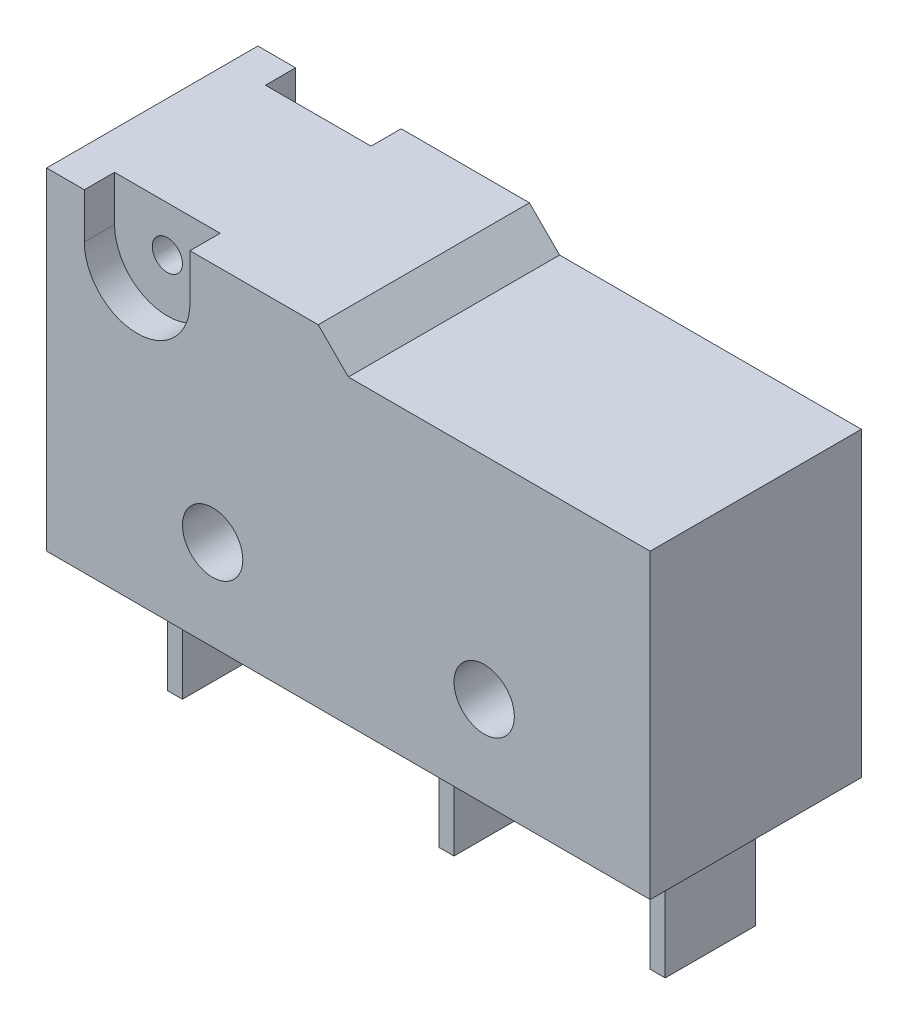
ISO-10303-21;
HEADER;
FILE_DESCRIPTION(('STEP AP214'),'2;1');
FILE_NAME('part.step','',(''),(''),'','','');
FILE_SCHEMA(('AUTOMOTIVE_DESIGN { 1 0 10303 214 1 1 1 1 }'));
ENDSEC;
DATA;
#1=APPLICATION_CONTEXT('core data for automotive mechanical design processes');
#2=APPLICATION_PROTOCOL_DEFINITION('international standard','automotive_design',2000,#1);
#3=PRODUCT_CONTEXT('',#1,'mechanical');
#4=PRODUCT('Part','Part','',(#3));
#5=PRODUCT_RELATED_PRODUCT_CATEGORY('part','',(#4));
#6=PRODUCT_DEFINITION_FORMATION('','',#4);
#7=PRODUCT_DEFINITION_CONTEXT('part definition',#1,'design');
#8=PRODUCT_DEFINITION('design','',#6,#7);
#9=PRODUCT_DEFINITION_SHAPE('','',#8);
#10=(LENGTH_UNIT() NAMED_UNIT(*) SI_UNIT(.MILLI.,.METRE.));
#11=(NAMED_UNIT(*) PLANE_ANGLE_UNIT() SI_UNIT($,.RADIAN.));
#12=(NAMED_UNIT(*) SI_UNIT($,.STERADIAN.) SOLID_ANGLE_UNIT());
#13=UNCERTAINTY_MEASURE_WITH_UNIT(LENGTH_MEASURE(1.E-05),#10,'distance_accuracy_value','');
#14=(GEOMETRIC_REPRESENTATION_CONTEXT(3) GLOBAL_UNCERTAINTY_ASSIGNED_CONTEXT((#13)) GLOBAL_UNIT_ASSIGNED_CONTEXT((#10,
#11,#12)) REPRESENTATION_CONTEXT('',''));
#15=CARTESIAN_POINT('',(0.,0.,0.));
#16=DIRECTION('',(0.,0.,1.));
#17=DIRECTION('',(1.,0.,0.));
#18=AXIS2_PLACEMENT_3D('',#15,#16,#17);
#19=CARTESIAN_POINT('',(18.,-4.,-1.5));
#20=DIRECTION('',(1.,0.,0.));
#21=DIRECTION('',(0.,0.,-1.));
#22=AXIS2_PLACEMENT_3D('',#19,#20,#21);
#23=PLANE('',#22);
#24=DIRECTION('',(0.,0.,-1.));
#25=VECTOR('',#24,1.);
#26=CARTESIAN_POINT('',(18.,0.,-1.5));
#27=LINE('',#26,#25);
#28=CARTESIAN_POINT('',(18.,0.,1.5));
#29=VERTEX_POINT('',#28);
#30=CARTESIAN_POINT('',(18.,0.,-1.5));
#31=VERTEX_POINT('',#30);
#32=EDGE_CURVE('E109',#29,#31,#27,.T.);
#33=ORIENTED_EDGE('',*,*,#32,.T.);
#34=DIRECTION('',(0.,1.,0.));
#35=VECTOR('',#34,1.);
#36=CARTESIAN_POINT('',(18.,-4.,-1.5));
#37=LINE('',#36,#35);
#38=CARTESIAN_POINT('',(18.,-4.,-1.5));
#39=VERTEX_POINT('',#38);
#40=EDGE_CURVE('E12',#39,#31,#37,.T.);
#41=ORIENTED_EDGE('',*,*,#40,.F.);
#42=DIRECTION('',(0.,0.,-1.));
#43=VECTOR('',#42,1.);
#44=CARTESIAN_POINT('',(18.,-4.,-1.5));
#45=LINE('',#44,#43);
#46=CARTESIAN_POINT('',(18.,-4.,1.5));
#47=VERTEX_POINT('',#46);
#48=EDGE_CURVE('E97',#47,#39,#45,.T.);
#49=ORIENTED_EDGE('',*,*,#48,.F.);
#50=DIRECTION('',(0.,1.,0.));
#51=VECTOR('',#50,1.);
#52=CARTESIAN_POINT('',(18.,-4.,1.5));
#53=LINE('',#52,#51);
#54=EDGE_CURVE('E105',#47,#29,#53,.T.);
#55=ORIENTED_EDGE('',*,*,#54,.T.);
#56=EDGE_LOOP('',(#33,#41,#49,#55));
#57=FACE_BOUND('',#56,.T.);
#58=ADVANCED_FACE('F46',(#57),#23,.F.);
#59=CARTESIAN_POINT('',(18.,-4.,-1.5));
#60=DIRECTION('',(0.,0.,1.));
#61=DIRECTION('',(1.,0.,0.));
#62=AXIS2_PLACEMENT_3D('',#59,#60,#61);
#63=PLANE('',#62);
#64=DIRECTION('',(1.,0.,0.));
#65=VECTOR('',#64,1.);
#66=CARTESIAN_POINT('',(18.,0.,-1.5));
#67=LINE('',#66,#65);
#68=CARTESIAN_POINT('',(18.5,0.,-1.5));
#69=VERTEX_POINT('',#68);
#70=EDGE_CURVE('E101',#31,#69,#67,.T.);
#71=ORIENTED_EDGE('',*,*,#70,.T.);
#72=DIRECTION('',(0.,1.,0.));
#73=VECTOR('',#72,1.);
#74=CARTESIAN_POINT('',(18.5,-4.,-1.5));
#75=LINE('',#74,#73);
#76=CARTESIAN_POINT('',(18.5,-4.,-1.5));
#77=VERTEX_POINT('',#76);
#78=EDGE_CURVE('E54',#77,#69,#75,.T.);
#79=ORIENTED_EDGE('',*,*,#78,.F.);
#80=DIRECTION('',(1.,0.,0.));
#81=VECTOR('',#80,1.);
#82=CARTESIAN_POINT('',(18.,-4.,-1.5));
#83=LINE('',#82,#81);
#84=EDGE_CURVE('E92',#39,#77,#83,.T.);
#85=ORIENTED_EDGE('',*,*,#84,.F.);
#86=ORIENTED_EDGE('',*,*,#40,.T.);
#87=EDGE_LOOP('',(#71,#79,#85,#86));
#88=FACE_BOUND('',#87,.T.);
#89=ADVANCED_FACE('F100',(#88),#63,.F.);
#90=CARTESIAN_POINT('',(18.5,-4.,-1.5));
#91=DIRECTION('',(-1.,0.,0.));
#92=DIRECTION('',(0.,0.,1.));
#93=AXIS2_PLACEMENT_3D('',#90,#91,#92);
#94=PLANE('',#93);
#95=DIRECTION('',(0.,0.,1.));
#96=VECTOR('',#95,1.);
#97=CARTESIAN_POINT('',(18.5,0.,-1.5));
#98=LINE('',#97,#96);
#99=CARTESIAN_POINT('',(18.5,0.,1.5));
#100=VERTEX_POINT('',#99);
#101=EDGE_CURVE('E79',#69,#100,#98,.T.);
#102=ORIENTED_EDGE('',*,*,#101,.T.);
#103=DIRECTION('',(0.,1.,0.));
#104=VECTOR('',#103,1.);
#105=CARTESIAN_POINT('',(18.5,-4.,1.5));
#106=LINE('',#105,#104);
#107=CARTESIAN_POINT('',(18.5,-4.,1.5));
#108=VERTEX_POINT('',#107);
#109=EDGE_CURVE('E102',#108,#100,#106,.T.);
#110=ORIENTED_EDGE('',*,*,#109,.F.);
#111=DIRECTION('',(0.,0.,1.));
#112=VECTOR('',#111,1.);
#113=CARTESIAN_POINT('',(18.5,-4.,-1.5));
#114=LINE('',#113,#112);
#115=EDGE_CURVE('E95',#77,#108,#114,.T.);
#116=ORIENTED_EDGE('',*,*,#115,.F.);
#117=ORIENTED_EDGE('',*,*,#78,.T.);
#118=EDGE_LOOP('',(#102,#110,#116,#117));
#119=FACE_BOUND('',#118,.T.);
#120=ADVANCED_FACE('F103',(#119),#94,.F.);
#121=CARTESIAN_POINT('',(18.,-4.,1.5));
#122=DIRECTION('',(0.,0.,-1.));
#123=DIRECTION('',(-1.,0.,0.));
#124=AXIS2_PLACEMENT_3D('',#121,#122,#123);
#125=PLANE('',#124);
#126=DIRECTION('',(-1.,0.,0.));
#127=VECTOR('',#126,1.);
#128=CARTESIAN_POINT('',(18.,0.,1.5));
#129=LINE('',#128,#127);
#130=EDGE_CURVE('E85',#100,#29,#129,.T.);
#131=ORIENTED_EDGE('',*,*,#130,.T.);
#132=ORIENTED_EDGE('',*,*,#54,.F.);
#133=DIRECTION('',(-1.,0.,0.));
#134=VECTOR('',#133,1.);
#135=CARTESIAN_POINT('',(18.,-4.,1.5));
#136=LINE('',#135,#134);
#137=EDGE_CURVE('E62',#108,#47,#136,.T.);
#138=ORIENTED_EDGE('',*,*,#137,.F.);
#139=ORIENTED_EDGE('',*,*,#109,.T.);
#140=EDGE_LOOP('',(#131,#132,#138,#139));
#141=FACE_BOUND('',#140,.T.);
#142=ADVANCED_FACE('F116',(#141),#125,.F.);
#143=CARTESIAN_POINT('',(0.,-4.,0.));
#144=DIRECTION('',(0.,1.,0.));
#145=DIRECTION('',(0.,0.,1.));
#146=AXIS2_PLACEMENT_3D('',#143,#144,#145);
#147=PLANE('',#146);
#148=ORIENTED_EDGE('',*,*,#48,.T.);
#149=ORIENTED_EDGE('',*,*,#84,.T.);
#150=ORIENTED_EDGE('',*,*,#115,.T.);
#151=ORIENTED_EDGE('',*,*,#137,.T.);
#152=EDGE_LOOP('',(#148,#149,#150,#151));
#153=FACE_BOUND('',#152,.T.);
#154=ADVANCED_FACE('F93',(#153),#147,.F.);
#155=CARTESIAN_POINT('',(0.,0.,0.));
#156=DIRECTION('',(0.,1.,0.));
#157=DIRECTION('',(0.,0.,1.));
#158=AXIS2_PLACEMENT_3D('',#155,#156,#157);
#159=PLANE('',#158);
#160=ORIENTED_EDGE('',*,*,#32,.F.);
#161=ORIENTED_EDGE('',*,*,#130,.F.);
#162=ORIENTED_EDGE('',*,*,#101,.F.);
#163=ORIENTED_EDGE('',*,*,#70,.F.);
#164=EDGE_LOOP('',(#160,#161,#162,#163));
#165=FACE_BOUND('',#164,.T.);
#166=ADVANCED_FACE('F119',(#165),#159,.T.);
#167=CLOSED_SHELL('',(#58,#89,#120,#142,#154,#166));
#168=MANIFOLD_SOLID_BREP('B2',#167);
#169=CARTESIAN_POINT('',(11.,-4.,1.5));
#170=DIRECTION('',(1.,0.,0.));
#171=DIRECTION('',(0.,0.,-1.));
#172=AXIS2_PLACEMENT_3D('',#169,#170,#171);
#173=PLANE('',#172);
#174=DIRECTION('',(0.,0.,-1.));
#175=VECTOR('',#174,1.);
#176=CARTESIAN_POINT('',(11.,0.,1.5));
#177=LINE('',#176,#175);
#178=CARTESIAN_POINT('',(11.,0.,1.5));
#179=VERTEX_POINT('',#178);
#180=CARTESIAN_POINT('',(11.,0.,-1.5));
#181=VERTEX_POINT('',#180);
#182=EDGE_CURVE('E243',#179,#181,#177,.T.);
#183=ORIENTED_EDGE('',*,*,#182,.T.);
#184=DIRECTION('',(0.,1.,0.));
#185=VECTOR('',#184,1.);
#186=CARTESIAN_POINT('',(11.,-4.,-1.5));
#187=LINE('',#186,#185);
#188=CARTESIAN_POINT('',(11.,-4.,-1.5));
#189=VERTEX_POINT('',#188);
#190=EDGE_CURVE('E44',#189,#181,#187,.T.);
#191=ORIENTED_EDGE('',*,*,#190,.F.);
#192=DIRECTION('',(0.,0.,-1.));
#193=VECTOR('',#192,1.);
#194=CARTESIAN_POINT('',(11.,-4.,1.5));
#195=LINE('',#194,#193);
#196=CARTESIAN_POINT('',(11.,-4.,1.5));
#197=VERTEX_POINT('',#196);
#198=EDGE_CURVE('E231',#197,#189,#195,.T.);
#199=ORIENTED_EDGE('',*,*,#198,.F.);
#200=DIRECTION('',(0.,1.,0.));
#201=VECTOR('',#200,1.);
#202=CARTESIAN_POINT('',(11.,-4.,1.5));
#203=LINE('',#202,#201);
#204=EDGE_CURVE('E239',#197,#179,#203,.T.);
#205=ORIENTED_EDGE('',*,*,#204,.T.);
#206=EDGE_LOOP('',(#183,#191,#199,#205));
#207=FACE_BOUND('',#206,.T.);
#208=ADVANCED_FACE('F180',(#207),#173,.F.);
#209=CARTESIAN_POINT('',(11.,-4.,-1.5));
#210=DIRECTION('',(0.,0.,1.));
#211=DIRECTION('',(1.,0.,0.));
#212=AXIS2_PLACEMENT_3D('',#209,#210,#211);
#213=PLANE('',#212);
#214=DIRECTION('',(1.,0.,0.));
#215=VECTOR('',#214,1.);
#216=CARTESIAN_POINT('',(11.,0.,-1.5));
#217=LINE('',#216,#215);
#218=CARTESIAN_POINT('',(11.5,0.,-1.5));
#219=VERTEX_POINT('',#218);
#220=EDGE_CURVE('E235',#181,#219,#217,.T.);
#221=ORIENTED_EDGE('',*,*,#220,.T.);
#222=DIRECTION('',(0.,1.,0.));
#223=VECTOR('',#222,1.);
#224=CARTESIAN_POINT('',(11.5,-4.,-1.5));
#225=LINE('',#224,#223);
#226=CARTESIAN_POINT('',(11.5,-4.,-1.5));
#227=VERTEX_POINT('',#226);
#228=EDGE_CURVE('E188',#227,#219,#225,.T.);
#229=ORIENTED_EDGE('',*,*,#228,.F.);
#230=DIRECTION('',(1.,0.,0.));
#231=VECTOR('',#230,1.);
#232=CARTESIAN_POINT('',(11.,-4.,-1.5));
#233=LINE('',#232,#231);
#234=EDGE_CURVE('E226',#189,#227,#233,.T.);
#235=ORIENTED_EDGE('',*,*,#234,.F.);
#236=ORIENTED_EDGE('',*,*,#190,.T.);
#237=EDGE_LOOP('',(#221,#229,#235,#236));
#238=FACE_BOUND('',#237,.T.);
#239=ADVANCED_FACE('F234',(#238),#213,.F.);
#240=CARTESIAN_POINT('',(11.5,-4.,1.5));
#241=DIRECTION('',(-1.,0.,0.));
#242=DIRECTION('',(0.,0.,1.));
#243=AXIS2_PLACEMENT_3D('',#240,#241,#242);
#244=PLANE('',#243);
#245=DIRECTION('',(0.,0.,1.));
#246=VECTOR('',#245,1.);
#247=CARTESIAN_POINT('',(11.5,0.,1.5));
#248=LINE('',#247,#246);
#249=CARTESIAN_POINT('',(11.5,0.,1.5));
#250=VERTEX_POINT('',#249);
#251=EDGE_CURVE('E213',#219,#250,#248,.T.);
#252=ORIENTED_EDGE('',*,*,#251,.T.);
#253=DIRECTION('',(0.,1.,0.));
#254=VECTOR('',#253,1.);
#255=CARTESIAN_POINT('',(11.5,-4.,1.5));
#256=LINE('',#255,#254);
#257=CARTESIAN_POINT('',(11.5,-4.,1.5));
#258=VERTEX_POINT('',#257);
#259=EDGE_CURVE('E236',#258,#250,#256,.T.);
#260=ORIENTED_EDGE('',*,*,#259,.F.);
#261=DIRECTION('',(0.,0.,1.));
#262=VECTOR('',#261,1.);
#263=CARTESIAN_POINT('',(11.5,-4.,1.5));
#264=LINE('',#263,#262);
#265=EDGE_CURVE('E229',#227,#258,#264,.T.);
#266=ORIENTED_EDGE('',*,*,#265,.F.);
#267=ORIENTED_EDGE('',*,*,#228,.T.);
#268=EDGE_LOOP('',(#252,#260,#266,#267));
#269=FACE_BOUND('',#268,.T.);
#270=ADVANCED_FACE('F237',(#269),#244,.F.);
#271=CARTESIAN_POINT('',(11.,-4.,1.5));
#272=DIRECTION('',(0.,0.,-1.));
#273=DIRECTION('',(-1.,0.,0.));
#274=AXIS2_PLACEMENT_3D('',#271,#272,#273);
#275=PLANE('',#274);
#276=DIRECTION('',(-1.,0.,0.));
#277=VECTOR('',#276,1.);
#278=CARTESIAN_POINT('',(11.,0.,1.5));
#279=LINE('',#278,#277);
#280=EDGE_CURVE('E219',#250,#179,#279,.T.);
#281=ORIENTED_EDGE('',*,*,#280,.T.);
#282=ORIENTED_EDGE('',*,*,#204,.F.);
#283=DIRECTION('',(-1.,0.,0.));
#284=VECTOR('',#283,1.);
#285=CARTESIAN_POINT('',(11.,-4.,1.5));
#286=LINE('',#285,#284);
#287=EDGE_CURVE('E196',#258,#197,#286,.T.);
#288=ORIENTED_EDGE('',*,*,#287,.F.);
#289=ORIENTED_EDGE('',*,*,#259,.T.);
#290=EDGE_LOOP('',(#281,#282,#288,#289));
#291=FACE_BOUND('',#290,.T.);
#292=ADVANCED_FACE('F250',(#291),#275,.F.);
#293=CARTESIAN_POINT('',(0.,-4.,0.));
#294=DIRECTION('',(0.,-1.,0.));
#295=DIRECTION('',(0.,0.,-1.));
#296=AXIS2_PLACEMENT_3D('',#293,#294,#295);
#297=PLANE('',#296);
#298=ORIENTED_EDGE('',*,*,#198,.T.);
#299=ORIENTED_EDGE('',*,*,#234,.T.);
#300=ORIENTED_EDGE('',*,*,#265,.T.);
#301=ORIENTED_EDGE('',*,*,#287,.T.);
#302=EDGE_LOOP('',(#298,#299,#300,#301));
#303=FACE_BOUND('',#302,.T.);
#304=ADVANCED_FACE('F227',(#303),#297,.T.);
#305=CARTESIAN_POINT('',(0.,0.,0.));
#306=DIRECTION('',(0.,-1.,0.));
#307=DIRECTION('',(0.,0.,-1.));
#308=AXIS2_PLACEMENT_3D('',#305,#306,#307);
#309=PLANE('',#308);
#310=ORIENTED_EDGE('',*,*,#182,.F.);
#311=ORIENTED_EDGE('',*,*,#280,.F.);
#312=ORIENTED_EDGE('',*,*,#251,.F.);
#313=ORIENTED_EDGE('',*,*,#220,.F.);
#314=EDGE_LOOP('',(#310,#311,#312,#313));
#315=FACE_BOUND('',#314,.T.);
#316=ADVANCED_FACE('F253',(#315),#309,.F.);
#317=CLOSED_SHELL('',(#208,#239,#270,#292,#304,#316));
#318=MANIFOLD_SOLID_BREP('B6',#317);
#319=CARTESIAN_POINT('',(2.,-4.,1.5));
#320=DIRECTION('',(1.,0.,0.));
#321=DIRECTION('',(0.,0.,-1.));
#322=AXIS2_PLACEMENT_3D('',#319,#320,#321);
#323=PLANE('',#322);
#324=DIRECTION('',(0.,0.,-1.));
#325=VECTOR('',#324,1.);
#326=CARTESIAN_POINT('',(2.,0.,1.5));
#327=LINE('',#326,#325);
#328=CARTESIAN_POINT('',(2.,0.,1.5));
#329=VERTEX_POINT('',#328);
#330=CARTESIAN_POINT('',(2.,0.,-1.5));
#331=VERTEX_POINT('',#330);
#332=EDGE_CURVE('E376',#329,#331,#327,.T.);
#333=ORIENTED_EDGE('',*,*,#332,.T.);
#334=DIRECTION('',(0.,1.,0.));
#335=VECTOR('',#334,1.);
#336=CARTESIAN_POINT('',(2.,-4.,-1.5));
#337=LINE('',#336,#335);
#338=CARTESIAN_POINT('',(2.,-4.,-1.5));
#339=VERTEX_POINT('',#338);
#340=EDGE_CURVE('E178',#339,#331,#337,.T.);
#341=ORIENTED_EDGE('',*,*,#340,.F.);
#342=DIRECTION('',(0.,0.,-1.));
#343=VECTOR('',#342,1.);
#344=CARTESIAN_POINT('',(2.,-4.,1.5));
#345=LINE('',#344,#343);
#346=CARTESIAN_POINT('',(2.,-4.,1.5));
#347=VERTEX_POINT('',#346);
#348=EDGE_CURVE('E364',#347,#339,#345,.T.);
#349=ORIENTED_EDGE('',*,*,#348,.F.);
#350=DIRECTION('',(0.,1.,0.));
#351=VECTOR('',#350,1.);
#352=CARTESIAN_POINT('',(2.,-4.,1.5));
#353=LINE('',#352,#351);
#354=EDGE_CURVE('E372',#347,#329,#353,.T.);
#355=ORIENTED_EDGE('',*,*,#354,.T.);
#356=EDGE_LOOP('',(#333,#341,#349,#355));
#357=FACE_BOUND('',#356,.T.);
#358=ADVANCED_FACE('F313',(#357),#323,.F.);
#359=CARTESIAN_POINT('',(2.,-4.,-1.5));
#360=DIRECTION('',(0.,0.,1.));
#361=DIRECTION('',(1.,0.,0.));
#362=AXIS2_PLACEMENT_3D('',#359,#360,#361);
#363=PLANE('',#362);
#364=DIRECTION('',(1.,0.,0.));
#365=VECTOR('',#364,1.);
#366=CARTESIAN_POINT('',(2.,0.,-1.5));
#367=LINE('',#366,#365);
#368=CARTESIAN_POINT('',(2.5,0.,-1.5));
#369=VERTEX_POINT('',#368);
#370=EDGE_CURVE('E368',#331,#369,#367,.T.);
#371=ORIENTED_EDGE('',*,*,#370,.T.);
#372=DIRECTION('',(0.,1.,0.));
#373=VECTOR('',#372,1.);
#374=CARTESIAN_POINT('',(2.5,-4.,-1.5));
#375=LINE('',#374,#373);
#376=CARTESIAN_POINT('',(2.5,-4.,-1.5));
#377=VERTEX_POINT('',#376);
#378=EDGE_CURVE('E321',#377,#369,#375,.T.);
#379=ORIENTED_EDGE('',*,*,#378,.F.);
#380=DIRECTION('',(1.,0.,0.));
#381=VECTOR('',#380,1.);
#382=CARTESIAN_POINT('',(2.,-4.,-1.5));
#383=LINE('',#382,#381);
#384=EDGE_CURVE('E359',#339,#377,#383,.T.);
#385=ORIENTED_EDGE('',*,*,#384,.F.);
#386=ORIENTED_EDGE('',*,*,#340,.T.);
#387=EDGE_LOOP('',(#371,#379,#385,#386));
#388=FACE_BOUND('',#387,.T.);
#389=ADVANCED_FACE('F367',(#388),#363,.F.);
#390=CARTESIAN_POINT('',(2.5,-4.,1.5));
#391=DIRECTION('',(-1.,0.,0.));
#392=DIRECTION('',(0.,0.,1.));
#393=AXIS2_PLACEMENT_3D('',#390,#391,#392);
#394=PLANE('',#393);
#395=DIRECTION('',(0.,0.,1.));
#396=VECTOR('',#395,1.);
#397=CARTESIAN_POINT('',(2.5,0.,1.5));
#398=LINE('',#397,#396);
#399=CARTESIAN_POINT('',(2.5,0.,1.5));
#400=VERTEX_POINT('',#399);
#401=EDGE_CURVE('E346',#369,#400,#398,.T.);
#402=ORIENTED_EDGE('',*,*,#401,.T.);
#403=DIRECTION('',(0.,1.,0.));
#404=VECTOR('',#403,1.);
#405=CARTESIAN_POINT('',(2.5,-4.,1.5));
#406=LINE('',#405,#404);
#407=CARTESIAN_POINT('',(2.5,-4.,1.5));
#408=VERTEX_POINT('',#407);
#409=EDGE_CURVE('E369',#408,#400,#406,.T.);
#410=ORIENTED_EDGE('',*,*,#409,.F.);
#411=DIRECTION('',(0.,0.,1.));
#412=VECTOR('',#411,1.);
#413=CARTESIAN_POINT('',(2.5,-4.,1.5));
#414=LINE('',#413,#412);
#415=EDGE_CURVE('E362',#377,#408,#414,.T.);
#416=ORIENTED_EDGE('',*,*,#415,.F.);
#417=ORIENTED_EDGE('',*,*,#378,.T.);
#418=EDGE_LOOP('',(#402,#410,#416,#417));
#419=FACE_BOUND('',#418,.T.);
#420=ADVANCED_FACE('F370',(#419),#394,.F.);
#421=CARTESIAN_POINT('',(2.,-4.,1.5));
#422=DIRECTION('',(0.,0.,-1.));
#423=DIRECTION('',(-1.,0.,0.));
#424=AXIS2_PLACEMENT_3D('',#421,#422,#423);
#425=PLANE('',#424);
#426=DIRECTION('',(-1.,0.,0.));
#427=VECTOR('',#426,1.);
#428=CARTESIAN_POINT('',(2.,0.,1.5));
#429=LINE('',#428,#427);
#430=EDGE_CURVE('E352',#400,#329,#429,.T.);
#431=ORIENTED_EDGE('',*,*,#430,.T.);
#432=ORIENTED_EDGE('',*,*,#354,.F.);
#433=DIRECTION('',(-1.,0.,0.));
#434=VECTOR('',#433,1.);
#435=CARTESIAN_POINT('',(2.,-4.,1.5));
#436=LINE('',#435,#434);
#437=EDGE_CURVE('E329',#408,#347,#436,.T.);
#438=ORIENTED_EDGE('',*,*,#437,.F.);
#439=ORIENTED_EDGE('',*,*,#409,.T.);
#440=EDGE_LOOP('',(#431,#432,#438,#439));
#441=FACE_BOUND('',#440,.T.);
#442=ADVANCED_FACE('F383',(#441),#425,.F.);
#443=CARTESIAN_POINT('',(0.,-4.,0.));
#444=DIRECTION('',(0.,-1.,0.));
#445=DIRECTION('',(0.,0.,-1.));
#446=AXIS2_PLACEMENT_3D('',#443,#444,#445);
#447=PLANE('',#446);
#448=ORIENTED_EDGE('',*,*,#348,.T.);
#449=ORIENTED_EDGE('',*,*,#384,.T.);
#450=ORIENTED_EDGE('',*,*,#415,.T.);
#451=ORIENTED_EDGE('',*,*,#437,.T.);
#452=EDGE_LOOP('',(#448,#449,#450,#451));
#453=FACE_BOUND('',#452,.T.);
#454=ADVANCED_FACE('F360',(#453),#447,.T.);
#455=CARTESIAN_POINT('',(0.,0.,0.));
#456=DIRECTION('',(0.,-1.,0.));
#457=DIRECTION('',(0.,0.,-1.));
#458=AXIS2_PLACEMENT_3D('',#455,#456,#457);
#459=PLANE('',#458);
#460=ORIENTED_EDGE('',*,*,#332,.F.);
#461=ORIENTED_EDGE('',*,*,#430,.F.);
#462=ORIENTED_EDGE('',*,*,#401,.F.);
#463=ORIENTED_EDGE('',*,*,#370,.F.);
#464=EDGE_LOOP('',(#460,#461,#462,#463));
#465=FACE_BOUND('',#464,.T.);
#466=ADVANCED_FACE('F386',(#465),#459,.F.);
#467=CLOSED_SHELL('',(#358,#389,#420,#442,#454,#466));
#468=MANIFOLD_SOLID_BREP('B38',#467);
#469=CARTESIAN_POINT('',(3.,9.5,3.5));
#470=DIRECTION('',(0.,0.,-1.));
#471=DIRECTION('',(-1.,0.,0.));
#472=AXIS2_PLACEMENT_3D('',#469,#470,#471);
#473=CYLINDRICAL_SURFACE('',#472,0.5);
#474=CARTESIAN_POINT('',(3.,9.5,2.5));
#475=DIRECTION('',(0.,0.,1.));
#476=DIRECTION('',(1.,0.,0.));
#477=AXIS2_PLACEMENT_3D('',#474,#475,#476);
#478=CIRCLE('',#477,0.5);
#479=CARTESIAN_POINT('',(3.5,9.5,2.5));
#480=VERTEX_POINT('',#479);
#481=EDGE_CURVE('E591',#480,#480,#478,.T.);
#482=ORIENTED_EDGE('',*,*,#481,.T.);
#483=EDGE_LOOP('',(#482));
#484=FACE_BOUND('',#483,.T.);
#485=CARTESIAN_POINT('',(3.,9.5,-2.5));
#486=DIRECTION('',(0.,0.,-1.));
#487=DIRECTION('',(-1.,0.,0.));
#488=AXIS2_PLACEMENT_3D('',#485,#486,#487);
#489=CIRCLE('',#488,0.5);
#490=CARTESIAN_POINT('',(2.5,9.5,-2.5));
#491=VERTEX_POINT('',#490);
#492=EDGE_CURVE('E568',#491,#491,#489,.T.);
#493=ORIENTED_EDGE('',*,*,#492,.T.);
#494=EDGE_LOOP('',(#493));
#495=FACE_BOUND('',#494,.T.);
#496=ADVANCED_FACE('F437',(#484,#495),#473,.F.);
#497=CARTESIAN_POINT('',(0.,0.,-3.5));
#498=DIRECTION('',(0.,0.,-1.));
#499=DIRECTION('',(-1.,0.,0.));
#500=AXIS2_PLACEMENT_3D('',#497,#498,#499);
#501=PLANE('',#500);
#502=CARTESIAN_POINT('',(14.5,3.,-3.5));
#503=DIRECTION('',(0.,0.,1.));
#504=DIRECTION('',(1.,0.,0.));
#505=AXIS2_PLACEMENT_3D('',#502,#503,#504);
#506=CIRCLE('',#505,1.);
#507=CARTESIAN_POINT('',(15.5,3.,-3.5));
#508=VERTEX_POINT('',#507);
#509=EDGE_CURVE('E600',#508,#508,#506,.T.);
#510=ORIENTED_EDGE('',*,*,#509,.T.);
#511=EDGE_LOOP('',(#510));
#512=FACE_BOUND('',#511,.T.);
#513=CARTESIAN_POINT('',(5.5,3.,-3.5));
#514=DIRECTION('',(0.,0.,1.));
#515=DIRECTION('',(1.,0.,0.));
#516=AXIS2_PLACEMENT_3D('',#513,#514,#515);
#517=CIRCLE('',#516,1.);
#518=CARTESIAN_POINT('',(6.5,3.,-3.5));
#519=VERTEX_POINT('',#518);
#520=EDGE_CURVE('E604',#519,#519,#517,.T.);
#521=ORIENTED_EDGE('',*,*,#520,.T.);
#522=EDGE_LOOP('',(#521));
#523=FACE_BOUND('',#522,.T.);
#524=CARTESIAN_POINT('',(3.,9.5,-3.5));
#525=DIRECTION('',(0.,0.,1.));
#526=DIRECTION('',(1.,0.,0.));
#527=AXIS2_PLACEMENT_3D('',#524,#525,#526);
#528=CIRCLE('',#527,1.75);
#529=CARTESIAN_POINT('',(1.25,9.5,-3.5));
#530=VERTEX_POINT('',#529);
#531=CARTESIAN_POINT('',(4.75,9.5,-3.5));
#532=VERTEX_POINT('',#531);
#533=EDGE_CURVE('E552',#530,#532,#528,.T.);
#534=ORIENTED_EDGE('',*,*,#533,.T.);
#535=DIRECTION('',(0.,1.,0.));
#536=VECTOR('',#535,1.);
#537=CARTESIAN_POINT('',(4.75,9.5,-3.5));
#538=LINE('',#537,#536);
#539=CARTESIAN_POINT('',(4.75,11.,-3.5));
#540=VERTEX_POINT('',#539);
#541=EDGE_CURVE('E557',#532,#540,#538,.T.);
#542=ORIENTED_EDGE('',*,*,#541,.T.);
#543=DIRECTION('',(-1.,0.,0.));
#544=VECTOR('',#543,1.);
#545=CARTESIAN_POINT('',(0.,11.,-3.5));
#546=LINE('',#545,#544);
#547=CARTESIAN_POINT('',(9.00000000000001,11.,-3.5));
#548=VERTEX_POINT('',#547);
#549=EDGE_CURVE('E617',#548,#540,#546,.T.);
#550=ORIENTED_EDGE('',*,*,#549,.F.);
#551=DIRECTION('',(-0.707106781186546,0.707106781186549,0.));
#552=VECTOR('',#551,1.);
#553=CARTESIAN_POINT('',(9.00000000000001,11.,-3.5));
#554=LINE('',#553,#552);
#555=CARTESIAN_POINT('',(10.,10.,-3.5));
#556=VERTEX_POINT('',#555);
#557=EDGE_CURVE('E638',#556,#548,#554,.T.);
#558=ORIENTED_EDGE('',*,*,#557,.F.);
#559=DIRECTION('',(-1.,0.,0.));
#560=VECTOR('',#559,1.);
#561=CARTESIAN_POINT('',(10.,10.,-3.5));
#562=LINE('',#561,#560);
#563=CARTESIAN_POINT('',(20.,10.,-3.5));
#564=VERTEX_POINT('',#563);
#565=EDGE_CURVE('E636',#564,#556,#562,.T.);
#566=ORIENTED_EDGE('',*,*,#565,.F.);
#567=DIRECTION('',(0.,1.,0.));
#568=VECTOR('',#567,1.);
#569=CARTESIAN_POINT('',(20.,0.,-3.5));
#570=LINE('',#569,#568);
#571=CARTESIAN_POINT('',(20.,0.,-3.5));
#572=VERTEX_POINT('',#571);
#573=EDGE_CURVE('E634',#572,#564,#570,.T.);
#574=ORIENTED_EDGE('',*,*,#573,.F.);
#575=DIRECTION('',(1.,0.,0.));
#576=VECTOR('',#575,1.);
#577=CARTESIAN_POINT('',(0.,0.,-3.5));
#578=LINE('',#577,#576);
#579=CARTESIAN_POINT('',(0.,0.,-3.5));
#580=VERTEX_POINT('',#579);
#581=EDGE_CURVE('E632',#580,#572,#578,.T.);
#582=ORIENTED_EDGE('',*,*,#581,.F.);
#583=DIRECTION('',(0.,-1.,0.));
#584=VECTOR('',#583,1.);
#585=CARTESIAN_POINT('',(0.,0.,-3.5));
#586=LINE('',#585,#584);
#587=CARTESIAN_POINT('',(0.,11.,-3.5));
#588=VERTEX_POINT('',#587);
#589=EDGE_CURVE('E610',#588,#580,#586,.T.);
#590=ORIENTED_EDGE('',*,*,#589,.F.);
#591=CARTESIAN_POINT('',(1.25,11.,-3.5));
#592=VERTEX_POINT('',#591);
#593=EDGE_CURVE('E640',#592,#588,#546,.T.);
#594=ORIENTED_EDGE('',*,*,#593,.F.);
#595=DIRECTION('',(0.,-1.,0.));
#596=VECTOR('',#595,1.);
#597=CARTESIAN_POINT('',(1.25,9.5,-3.5));
#598=LINE('',#597,#596);
#599=EDGE_CURVE('E560',#592,#530,#598,.T.);
#600=ORIENTED_EDGE('',*,*,#599,.T.);
#601=EDGE_LOOP('',(#534,#542,#550,#558,#566,#574,#582,#590,#594,#600));
#602=FACE_BOUND('',#601,.T.);
#603=ADVANCED_FACE('F700',(#512,#523,#602),#501,.T.);
#604=CARTESIAN_POINT('',(0.,11.,3.5));
#605=DIRECTION('',(0.,-1.,0.));
#606=DIRECTION('',(0.,0.,-1.));
#607=AXIS2_PLACEMENT_3D('',#604,#605,#606);
#608=PLANE('',#607);
#609=DIRECTION('',(0.,0.,-1.));
#610=VECTOR('',#609,1.);
#611=CARTESIAN_POINT('',(4.75,11.,-2.5));
#612=LINE('',#611,#610);
#613=CARTESIAN_POINT('',(4.75,11.,-2.5));
#614=VERTEX_POINT('',#613);
#615=EDGE_CURVE('E569',#614,#540,#612,.T.);
#616=ORIENTED_EDGE('',*,*,#615,.F.);
#617=DIRECTION('',(1.,0.,0.));
#618=VECTOR('',#617,1.);
#619=CARTESIAN_POINT('',(0.,11.,-2.5));
#620=LINE('',#619,#618);
#621=CARTESIAN_POINT('',(1.25,11.,-2.5));
#622=VERTEX_POINT('',#621);
#623=EDGE_CURVE('E311',#622,#614,#620,.T.);
#624=ORIENTED_EDGE('',*,*,#623,.F.);
#625=DIRECTION('',(0.,0.,-1.));
#626=VECTOR('',#625,1.);
#627=CARTESIAN_POINT('',(1.25,11.,-2.5));
#628=LINE('',#627,#626);
#629=EDGE_CURVE('E541',#622,#592,#628,.T.);
#630=ORIENTED_EDGE('',*,*,#629,.T.);
#631=ORIENTED_EDGE('',*,*,#593,.T.);
#632=DIRECTION('',(0.,0.,-1.));
#633=VECTOR('',#632,1.);
#634=CARTESIAN_POINT('',(0.,11.,3.5));
#635=LINE('',#634,#633);
#636=CARTESIAN_POINT('',(0.,11.,3.5));
#637=VERTEX_POINT('',#636);
#638=EDGE_CURVE('E629',#637,#588,#635,.T.);
#639=ORIENTED_EDGE('',*,*,#638,.F.);
#640=DIRECTION('',(-1.,0.,0.));
#641=VECTOR('',#640,1.);
#642=CARTESIAN_POINT('',(0.,11.,3.5));
#643=LINE('',#642,#641);
#644=CARTESIAN_POINT('',(1.25,11.,3.5));
#645=VERTEX_POINT('',#644);
#646=EDGE_CURVE('E625',#645,#637,#643,.T.);
#647=ORIENTED_EDGE('',*,*,#646,.F.);
#648=DIRECTION('',(0.,0.,1.));
#649=VECTOR('',#648,1.);
#650=CARTESIAN_POINT('',(1.25,11.,2.5));
#651=LINE('',#650,#649);
#652=CARTESIAN_POINT('',(1.25,11.,2.5));
#653=VERTEX_POINT('',#652);
#654=EDGE_CURVE('E592',#653,#645,#651,.T.);
#655=ORIENTED_EDGE('',*,*,#654,.F.);
#656=DIRECTION('',(-1.,0.,0.));
#657=VECTOR('',#656,1.);
#658=CARTESIAN_POINT('',(0.,11.,2.5));
#659=LINE('',#658,#657);
#660=CARTESIAN_POINT('',(4.75,11.,2.5));
#661=VERTEX_POINT('',#660);
#662=EDGE_CURVE('E598',#661,#653,#659,.T.);
#663=ORIENTED_EDGE('',*,*,#662,.F.);
#664=DIRECTION('',(0.,0.,1.));
#665=VECTOR('',#664,1.);
#666=CARTESIAN_POINT('',(4.75,11.,2.5));
#667=LINE('',#666,#665);
#668=CARTESIAN_POINT('',(4.75,11.,3.5));
#669=VERTEX_POINT('',#668);
#670=EDGE_CURVE('E594',#661,#669,#667,.T.);
#671=ORIENTED_EDGE('',*,*,#670,.T.);
#672=CARTESIAN_POINT('',(9.00000000000001,11.,3.5));
#673=VERTEX_POINT('',#672);
#674=EDGE_CURVE('E626',#673,#669,#643,.T.);
#675=ORIENTED_EDGE('',*,*,#674,.F.);
#676=DIRECTION('',(0.,0.,-1.));
#677=VECTOR('',#676,1.);
#678=CARTESIAN_POINT('',(9.00000000000001,11.,3.5));
#679=LINE('',#678,#677);
#680=EDGE_CURVE('E645',#673,#548,#679,.T.);
#681=ORIENTED_EDGE('',*,*,#680,.T.);
#682=ORIENTED_EDGE('',*,*,#549,.T.);
#683=EDGE_LOOP('',(#616,#624,#630,#631,#639,#647,#655,#663,#671,#675,#681,#682));
#684=FACE_BOUND('',#683,.T.);
#685=ADVANCED_FACE('F678',(#684),#608,.F.);
#686=CARTESIAN_POINT('',(0.,0.,3.5));
#687=DIRECTION('',(0.,0.,-1.));
#688=DIRECTION('',(-1.,0.,0.));
#689=AXIS2_PLACEMENT_3D('',#686,#687,#688);
#690=PLANE('',#689);
#691=CARTESIAN_POINT('',(5.5,3.,3.5));
#692=DIRECTION('',(0.,0.,1.));
#693=DIRECTION('',(1.,0.,0.));
#694=AXIS2_PLACEMENT_3D('',#691,#692,#693);
#695=CIRCLE('',#694,1.);
#696=CARTESIAN_POINT('',(6.5,3.,3.5));
#697=VERTEX_POINT('',#696);
#698=EDGE_CURVE('E607',#697,#697,#695,.T.);
#699=ORIENTED_EDGE('',*,*,#698,.F.);
#700=EDGE_LOOP('',(#699));
#701=FACE_BOUND('',#700,.T.);
#702=CARTESIAN_POINT('',(3.,9.5,3.5));
#703=DIRECTION('',(0.,0.,1.));
#704=DIRECTION('',(1.,0.,0.));
#705=AXIS2_PLACEMENT_3D('',#702,#703,#704);
#706=CIRCLE('',#705,1.75);
#707=CARTESIAN_POINT('',(1.25,9.5,3.5));
#708=VERTEX_POINT('',#707);
#709=CARTESIAN_POINT('',(4.75,9.5,3.5));
#710=VERTEX_POINT('',#709);
#711=EDGE_CURVE('E574',#708,#710,#706,.T.);
#712=ORIENTED_EDGE('',*,*,#711,.F.);
#713=DIRECTION('',(0.,-1.,0.));
#714=VECTOR('',#713,1.);
#715=CARTESIAN_POINT('',(1.25,9.5,3.5));
#716=LINE('',#715,#714);
#717=EDGE_CURVE('E577',#645,#708,#716,.T.);
#718=ORIENTED_EDGE('',*,*,#717,.F.);
#719=ORIENTED_EDGE('',*,*,#646,.T.);
#720=DIRECTION('',(0.,-1.,0.));
#721=VECTOR('',#720,1.);
#722=CARTESIAN_POINT('',(0.,0.,3.5));
#723=LINE('',#722,#721);
#724=CARTESIAN_POINT('',(0.,0.,3.5));
#725=VERTEX_POINT('',#724);
#726=EDGE_CURVE('E613',#637,#725,#723,.T.);
#727=ORIENTED_EDGE('',*,*,#726,.T.);
#728=DIRECTION('',(1.,0.,0.));
#729=VECTOR('',#728,1.);
#730=CARTESIAN_POINT('',(0.,0.,3.5));
#731=LINE('',#730,#729);
#732=CARTESIAN_POINT('',(20.,0.,3.5));
#733=VERTEX_POINT('',#732);
#734=EDGE_CURVE('E616',#725,#733,#731,.T.);
#735=ORIENTED_EDGE('',*,*,#734,.T.);
#736=DIRECTION('',(0.,1.,0.));
#737=VECTOR('',#736,1.);
#738=CARTESIAN_POINT('',(20.,0.,3.5));
#739=LINE('',#738,#737);
#740=CARTESIAN_POINT('',(20.,10.,3.5));
#741=VERTEX_POINT('',#740);
#742=EDGE_CURVE('E619',#733,#741,#739,.T.);
#743=ORIENTED_EDGE('',*,*,#742,.T.);
#744=DIRECTION('',(-1.,0.,0.));
#745=VECTOR('',#744,1.);
#746=CARTESIAN_POINT('',(10.,10.,3.5));
#747=LINE('',#746,#745);
#748=CARTESIAN_POINT('',(10.,10.,3.5));
#749=VERTEX_POINT('',#748);
#750=EDGE_CURVE('E621',#741,#749,#747,.T.);
#751=ORIENTED_EDGE('',*,*,#750,.T.);
#752=DIRECTION('',(-0.707106781186546,0.707106781186549,0.));
#753=VECTOR('',#752,1.);
#754=CARTESIAN_POINT('',(9.00000000000001,11.,3.5));
#755=LINE('',#754,#753);
#756=EDGE_CURVE('E623',#749,#673,#755,.T.);
#757=ORIENTED_EDGE('',*,*,#756,.T.);
#758=ORIENTED_EDGE('',*,*,#674,.T.);
#759=DIRECTION('',(0.,1.,0.));
#760=VECTOR('',#759,1.);
#761=CARTESIAN_POINT('',(4.75,9.5,3.5));
#762=LINE('',#761,#760);
#763=EDGE_CURVE('E585',#710,#669,#762,.T.);
#764=ORIENTED_EDGE('',*,*,#763,.F.);
#765=EDGE_LOOP('',(#712,#718,#719,#727,#735,#743,#751,#757,#758,#764));
#766=FACE_BOUND('',#765,.T.);
#767=CARTESIAN_POINT('',(14.5,3.,3.5));
#768=DIRECTION('',(0.,0.,1.));
#769=DIRECTION('',(1.,0.,0.));
#770=AXIS2_PLACEMENT_3D('',#767,#768,#769);
#771=CIRCLE('',#770,1.);
#772=CARTESIAN_POINT('',(15.5,3.,3.5));
#773=VERTEX_POINT('',#772);
#774=EDGE_CURVE('E601',#773,#773,#771,.T.);
#775=ORIENTED_EDGE('',*,*,#774,.F.);
#776=EDGE_LOOP('',(#775));
#777=FACE_BOUND('',#776,.T.);
#778=ADVANCED_FACE('F683',(#701,#766,#777),#690,.F.);
#779=CARTESIAN_POINT('',(0.,0.,3.5));
#780=DIRECTION('',(1.,0.,0.));
#781=DIRECTION('',(0.,0.,-1.));
#782=AXIS2_PLACEMENT_3D('',#779,#780,#781);
#783=PLANE('',#782);
#784=ORIENTED_EDGE('',*,*,#589,.T.);
#785=DIRECTION('',(0.,0.,-1.));
#786=VECTOR('',#785,1.);
#787=CARTESIAN_POINT('',(0.,0.,3.5));
#788=LINE('',#787,#786);
#789=EDGE_CURVE('E445',#725,#580,#788,.T.);
#790=ORIENTED_EDGE('',*,*,#789,.F.);
#791=ORIENTED_EDGE('',*,*,#726,.F.);
#792=ORIENTED_EDGE('',*,*,#638,.T.);
#793=EDGE_LOOP('',(#784,#790,#791,#792));
#794=FACE_BOUND('',#793,.T.);
#795=ADVANCED_FACE('F439',(#794),#783,.F.);
#796=CARTESIAN_POINT('',(0.,0.,3.5));
#797=DIRECTION('',(0.,1.,0.));
#798=DIRECTION('',(0.,0.,1.));
#799=AXIS2_PLACEMENT_3D('',#796,#797,#798);
#800=PLANE('',#799);
#801=ORIENTED_EDGE('',*,*,#581,.T.);
#802=DIRECTION('',(0.,0.,-1.));
#803=VECTOR('',#802,1.);
#804=CARTESIAN_POINT('',(20.,0.,3.5));
#805=LINE('',#804,#803);
#806=EDGE_CURVE('E654',#733,#572,#805,.T.);
#807=ORIENTED_EDGE('',*,*,#806,.F.);
#808=ORIENTED_EDGE('',*,*,#734,.F.);
#809=ORIENTED_EDGE('',*,*,#789,.T.);
#810=EDGE_LOOP('',(#801,#807,#808,#809));
#811=FACE_BOUND('',#810,.T.);
#812=ADVANCED_FACE('F709',(#811),#800,.F.);
#813=CARTESIAN_POINT('',(20.,0.,3.5));
#814=DIRECTION('',(-1.,0.,0.));
#815=DIRECTION('',(0.,0.,1.));
#816=AXIS2_PLACEMENT_3D('',#813,#814,#815);
#817=PLANE('',#816);
#818=ORIENTED_EDGE('',*,*,#573,.T.);
#819=DIRECTION('',(0.,0.,-1.));
#820=VECTOR('',#819,1.);
#821=CARTESIAN_POINT('',(20.,10.,3.5));
#822=LINE('',#821,#820);
#823=EDGE_CURVE('E651',#741,#564,#822,.T.);
#824=ORIENTED_EDGE('',*,*,#823,.F.);
#825=ORIENTED_EDGE('',*,*,#742,.F.);
#826=ORIENTED_EDGE('',*,*,#806,.T.);
#827=EDGE_LOOP('',(#818,#824,#825,#826));
#828=FACE_BOUND('',#827,.T.);
#829=ADVANCED_FACE('F714',(#828),#817,.F.);
#830=CARTESIAN_POINT('',(10.,10.,3.5));
#831=DIRECTION('',(0.,-1.,0.));
#832=DIRECTION('',(0.,0.,-1.));
#833=AXIS2_PLACEMENT_3D('',#830,#831,#832);
#834=PLANE('',#833);
#835=ORIENTED_EDGE('',*,*,#565,.T.);
#836=DIRECTION('',(0.,0.,-1.));
#837=VECTOR('',#836,1.);
#838=CARTESIAN_POINT('',(10.,10.,3.5));
#839=LINE('',#838,#837);
#840=EDGE_CURVE('E648',#749,#556,#839,.T.);
#841=ORIENTED_EDGE('',*,*,#840,.F.);
#842=ORIENTED_EDGE('',*,*,#750,.F.);
#843=ORIENTED_EDGE('',*,*,#823,.T.);
#844=EDGE_LOOP('',(#835,#841,#842,#843));
#845=FACE_BOUND('',#844,.T.);
#846=ADVANCED_FACE('F716',(#845),#834,.F.);
#847=CARTESIAN_POINT('',(9.00000000000001,11.,3.5));
#848=DIRECTION('',(-0.707106781186549,-0.707106781186546,0.));
#849=DIRECTION('',(0.707106781186546,-0.707106781186549,0.));
#850=AXIS2_PLACEMENT_3D('',#847,#848,#849);
#851=PLANE('',#850);
#852=ORIENTED_EDGE('',*,*,#557,.T.);
#853=ORIENTED_EDGE('',*,*,#680,.F.);
#854=ORIENTED_EDGE('',*,*,#756,.F.);
#855=ORIENTED_EDGE('',*,*,#840,.T.);
#856=EDGE_LOOP('',(#852,#853,#854,#855));
#857=FACE_BOUND('',#856,.T.);
#858=ADVANCED_FACE('F696',(#857),#851,.F.);
#859=CARTESIAN_POINT('',(5.5,3.,3.5));
#860=DIRECTION('',(0.,0.,-1.));
#861=DIRECTION('',(-1.,0.,0.));
#862=AXIS2_PLACEMENT_3D('',#859,#860,#861);
#863=CYLINDRICAL_SURFACE('',#862,1.);
#864=ORIENTED_EDGE('',*,*,#698,.T.);
#865=EDGE_LOOP('',(#864));
#866=FACE_BOUND('',#865,.T.);
#867=ORIENTED_EDGE('',*,*,#520,.F.);
#868=EDGE_LOOP('',(#867));
#869=FACE_BOUND('',#868,.T.);
#870=ADVANCED_FACE('F723',(#866,#869),#863,.F.);
#871=CARTESIAN_POINT('',(14.5,3.,3.5));
#872=DIRECTION('',(0.,0.,-1.));
#873=DIRECTION('',(-1.,0.,0.));
#874=AXIS2_PLACEMENT_3D('',#871,#872,#873);
#875=CYLINDRICAL_SURFACE('',#874,1.);
#876=ORIENTED_EDGE('',*,*,#774,.T.);
#877=EDGE_LOOP('',(#876));
#878=FACE_BOUND('',#877,.T.);
#879=ORIENTED_EDGE('',*,*,#509,.F.);
#880=EDGE_LOOP('',(#879));
#881=FACE_BOUND('',#880,.T.);
#882=ADVANCED_FACE('F666',(#878,#881),#875,.F.);
#883=CARTESIAN_POINT('',(3.,9.5,2.5));
#884=DIRECTION('',(0.,0.,1.));
#885=DIRECTION('',(1.,0.,0.));
#886=AXIS2_PLACEMENT_3D('',#883,#884,#885);
#887=PLANE('',#886);
#888=ORIENTED_EDGE('',*,*,#481,.F.);
#889=EDGE_LOOP('',(#888));
#890=FACE_BOUND('',#889,.T.);
#891=ORIENTED_EDGE('',*,*,#662,.T.);
#892=DIRECTION('',(0.,-1.,0.));
#893=VECTOR('',#892,1.);
#894=CARTESIAN_POINT('',(1.25,9.5,2.5));
#895=LINE('',#894,#893);
#896=CARTESIAN_POINT('',(1.25,9.5,2.5));
#897=VERTEX_POINT('',#896);
#898=EDGE_CURVE('E579',#653,#897,#895,.T.);
#899=ORIENTED_EDGE('',*,*,#898,.T.);
#900=CARTESIAN_POINT('',(3.,9.5,2.5));
#901=DIRECTION('',(0.,0.,1.));
#902=DIRECTION('',(1.,0.,0.));
#903=AXIS2_PLACEMENT_3D('',#900,#901,#902);
#904=CIRCLE('',#903,1.75);
#905=CARTESIAN_POINT('',(4.75,9.5,2.5));
#906=VERTEX_POINT('',#905);
#907=EDGE_CURVE('E575',#897,#906,#904,.T.);
#908=ORIENTED_EDGE('',*,*,#907,.T.);
#909=DIRECTION('',(0.,1.,0.));
#910=VECTOR('',#909,1.);
#911=CARTESIAN_POINT('',(4.75,9.5,2.5));
#912=LINE('',#911,#910);
#913=EDGE_CURVE('E459',#906,#661,#912,.T.);
#914=ORIENTED_EDGE('',*,*,#913,.T.);
#915=EDGE_LOOP('',(#891,#899,#908,#914));
#916=FACE_BOUND('',#915,.T.);
#917=ADVANCED_FACE('F663',(#890,#916),#887,.T.);
#918=CARTESIAN_POINT('',(3.,9.5,2.5));
#919=DIRECTION('',(0.,0.,1.));
#920=DIRECTION('',(1.,0.,0.));
#921=AXIS2_PLACEMENT_3D('',#918,#919,#920);
#922=CYLINDRICAL_SURFACE('',#921,1.75);
#923=ORIENTED_EDGE('',*,*,#711,.T.);
#924=DIRECTION('',(0.,0.,1.));
#925=VECTOR('',#924,1.);
#926=CARTESIAN_POINT('',(4.75,9.5,2.5));
#927=LINE('',#926,#925);
#928=EDGE_CURVE('E582',#906,#710,#927,.T.);
#929=ORIENTED_EDGE('',*,*,#928,.F.);
#930=ORIENTED_EDGE('',*,*,#907,.F.);
#931=DIRECTION('',(0.,0.,1.));
#932=VECTOR('',#931,1.);
#933=CARTESIAN_POINT('',(1.25,9.5,2.5));
#934=LINE('',#933,#932);
#935=EDGE_CURVE('E589',#897,#708,#934,.T.);
#936=ORIENTED_EDGE('',*,*,#935,.T.);
#937=EDGE_LOOP('',(#923,#929,#930,#936));
#938=FACE_BOUND('',#937,.T.);
#939=ADVANCED_FACE('F665',(#938),#922,.F.);
#940=CARTESIAN_POINT('',(1.25,9.5,2.5));
#941=DIRECTION('',(-1.,0.,0.));
#942=DIRECTION('',(0.,0.,1.));
#943=AXIS2_PLACEMENT_3D('',#940,#941,#942);
#944=PLANE('',#943);
#945=ORIENTED_EDGE('',*,*,#717,.T.);
#946=ORIENTED_EDGE('',*,*,#935,.F.);
#947=ORIENTED_EDGE('',*,*,#898,.F.);
#948=ORIENTED_EDGE('',*,*,#654,.T.);
#949=EDGE_LOOP('',(#945,#946,#947,#948));
#950=FACE_BOUND('',#949,.T.);
#951=ADVANCED_FACE('F673',(#950),#944,.F.);
#952=CARTESIAN_POINT('',(4.75,9.5,2.5));
#953=DIRECTION('',(1.,0.,0.));
#954=DIRECTION('',(0.,0.,-1.));
#955=AXIS2_PLACEMENT_3D('',#952,#953,#954);
#956=PLANE('',#955);
#957=ORIENTED_EDGE('',*,*,#763,.T.);
#958=ORIENTED_EDGE('',*,*,#670,.F.);
#959=ORIENTED_EDGE('',*,*,#913,.F.);
#960=ORIENTED_EDGE('',*,*,#928,.T.);
#961=EDGE_LOOP('',(#957,#958,#959,#960));
#962=FACE_BOUND('',#961,.T.);
#963=ADVANCED_FACE('F689',(#962),#956,.F.);
#964=CARTESIAN_POINT('',(3.,9.5,-2.5));
#965=DIRECTION('',(0.,0.,-1.));
#966=DIRECTION('',(1.,0.,0.));
#967=AXIS2_PLACEMENT_3D('',#964,#965,#966);
#968=PLANE('',#967);
#969=ORIENTED_EDGE('',*,*,#492,.F.);
#970=EDGE_LOOP('',(#969));
#971=FACE_BOUND('',#970,.T.);
#972=ORIENTED_EDGE('',*,*,#623,.T.);
#973=DIRECTION('',(0.,1.,0.));
#974=VECTOR('',#973,1.);
#975=CARTESIAN_POINT('',(4.75,9.5,-2.5));
#976=LINE('',#975,#974);
#977=CARTESIAN_POINT('',(4.75,9.5,-2.5));
#978=VERTEX_POINT('',#977);
#979=EDGE_CURVE('E543',#978,#614,#976,.T.);
#980=ORIENTED_EDGE('',*,*,#979,.F.);
#981=CARTESIAN_POINT('',(3.,9.5,-2.5));
#982=DIRECTION('',(0.,0.,1.));
#983=DIRECTION('',(1.,0.,0.));
#984=AXIS2_PLACEMENT_3D('',#981,#982,#983);
#985=CIRCLE('',#984,1.75);
#986=CARTESIAN_POINT('',(1.25,9.5,-2.5));
#987=VERTEX_POINT('',#986);
#988=EDGE_CURVE('E544',#987,#978,#985,.T.);
#989=ORIENTED_EDGE('',*,*,#988,.F.);
#990=DIRECTION('',(0.,-1.,0.));
#991=VECTOR('',#990,1.);
#992=CARTESIAN_POINT('',(1.25,9.5,-2.5));
#993=LINE('',#992,#991);
#994=EDGE_CURVE('E451',#622,#987,#993,.T.);
#995=ORIENTED_EDGE('',*,*,#994,.F.);
#996=EDGE_LOOP('',(#972,#980,#989,#995));
#997=FACE_BOUND('',#996,.T.);
#998=ADVANCED_FACE('F555',(#971,#997),#968,.T.);
#999=CARTESIAN_POINT('',(3.,9.5,-2.5));
#1000=DIRECTION('',(0.,0.,-1.));
#1001=DIRECTION('',(-1.,0.,0.));
#1002=AXIS2_PLACEMENT_3D('',#999,#1000,#1001);
#1003=CYLINDRICAL_SURFACE('',#1002,1.75);
#1004=ORIENTED_EDGE('',*,*,#533,.F.);
#1005=DIRECTION('',(0.,0.,-1.));
#1006=VECTOR('',#1005,1.);
#1007=CARTESIAN_POINT('',(1.25,9.5,-2.5));
#1008=LINE('',#1007,#1006);
#1009=EDGE_CURVE('E538',#987,#530,#1008,.T.);
#1010=ORIENTED_EDGE('',*,*,#1009,.F.);
#1011=ORIENTED_EDGE('',*,*,#988,.T.);
#1012=DIRECTION('',(0.,0.,-1.));
#1013=VECTOR('',#1012,1.);
#1014=CARTESIAN_POINT('',(4.75,9.5,-2.5));
#1015=LINE('',#1014,#1013);
#1016=EDGE_CURVE('E566',#978,#532,#1015,.T.);
#1017=ORIENTED_EDGE('',*,*,#1016,.T.);
#1018=EDGE_LOOP('',(#1004,#1010,#1011,#1017));
#1019=FACE_BOUND('',#1018,.T.);
#1020=ADVANCED_FACE('F548',(#1019),#1003,.F.);
#1021=CARTESIAN_POINT('',(4.75,9.5,-2.5));
#1022=DIRECTION('',(-1.,0.,0.));
#1023=DIRECTION('',(0.,0.,1.));
#1024=AXIS2_PLACEMENT_3D('',#1021,#1022,#1023);
#1025=PLANE('',#1024);
#1026=ORIENTED_EDGE('',*,*,#541,.F.);
#1027=ORIENTED_EDGE('',*,*,#1016,.F.);
#1028=ORIENTED_EDGE('',*,*,#979,.T.);
#1029=ORIENTED_EDGE('',*,*,#615,.T.);
#1030=EDGE_LOOP('',(#1026,#1027,#1028,#1029));
#1031=FACE_BOUND('',#1030,.T.);
#1032=ADVANCED_FACE('F703',(#1031),#1025,.T.);
#1033=CARTESIAN_POINT('',(1.25,9.5,-2.5));
#1034=DIRECTION('',(1.,0.,0.));
#1035=DIRECTION('',(0.,0.,-1.));
#1036=AXIS2_PLACEMENT_3D('',#1033,#1034,#1035);
#1037=PLANE('',#1036);
#1038=ORIENTED_EDGE('',*,*,#599,.F.);
#1039=ORIENTED_EDGE('',*,*,#629,.F.);
#1040=ORIENTED_EDGE('',*,*,#994,.T.);
#1041=ORIENTED_EDGE('',*,*,#1009,.T.);
#1042=EDGE_LOOP('',(#1038,#1039,#1040,#1041));
#1043=FACE_BOUND('',#1042,.T.);
#1044=ADVANCED_FACE('F537',(#1043),#1037,.T.);
#1045=CLOSED_SHELL('',(#496,#603,#685,#778,#795,#812,#829,#846,#858,#870,#882,#917,#939,#951,
#963,#998,#1020,#1032,#1044));
#1046=MANIFOLD_SOLID_BREP('B172',#1045);
#1047=ADVANCED_BREP_SHAPE_REPRESENTATION('',(#18,#168,#318,#468,#1046),#14);
#1048=SHAPE_DEFINITION_REPRESENTATION(#9,#1047);
ENDSEC;
END-ISO-10303-21;
